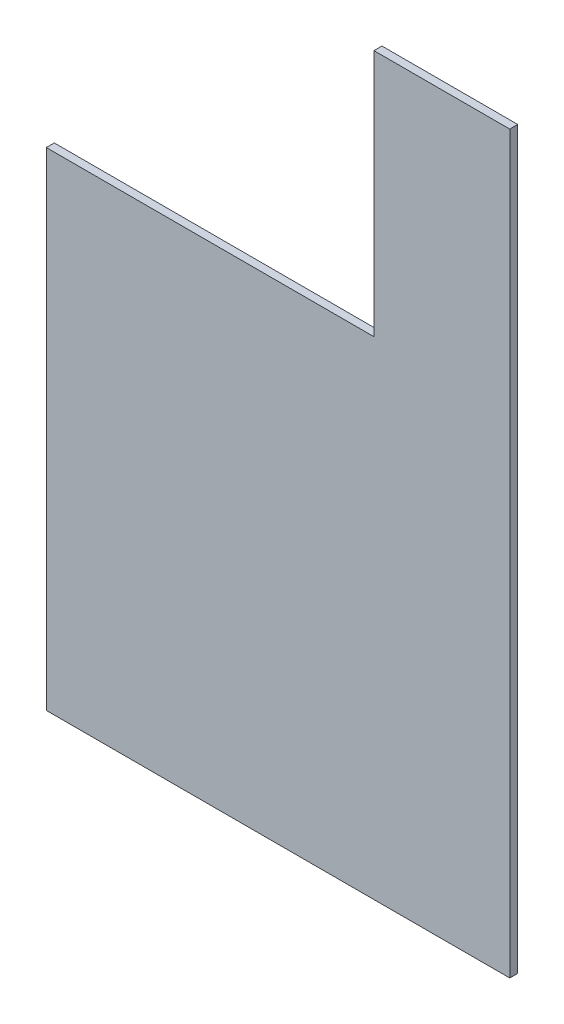
ISO-10303-21;
HEADER;
FILE_DESCRIPTION(('STEP AP214'),'2;1');
FILE_NAME('part.step','',(''),(''),'','','');
FILE_SCHEMA(('AUTOMOTIVE_DESIGN { 1 0 10303 214 1 1 1 1 }'));
ENDSEC;
DATA;
#1=APPLICATION_CONTEXT('core data for automotive mechanical design processes');
#2=APPLICATION_PROTOCOL_DEFINITION('international standard','automotive_design',2000,#1);
#3=PRODUCT_CONTEXT('',#1,'mechanical');
#4=PRODUCT('Part','Part','',(#3));
#5=PRODUCT_RELATED_PRODUCT_CATEGORY('part','',(#4));
#6=PRODUCT_DEFINITION_FORMATION('','',#4);
#7=PRODUCT_DEFINITION_CONTEXT('part definition',#1,'design');
#8=PRODUCT_DEFINITION('design','',#6,#7);
#9=PRODUCT_DEFINITION_SHAPE('','',#8);
#10=(LENGTH_UNIT() NAMED_UNIT(*) SI_UNIT(.MILLI.,.METRE.));
#11=(NAMED_UNIT(*) PLANE_ANGLE_UNIT() SI_UNIT($,.RADIAN.));
#12=(NAMED_UNIT(*) SI_UNIT($,.STERADIAN.) SOLID_ANGLE_UNIT());
#13=UNCERTAINTY_MEASURE_WITH_UNIT(LENGTH_MEASURE(1.E-05),#10,'distance_accuracy_value','');
#14=(GEOMETRIC_REPRESENTATION_CONTEXT(3) GLOBAL_UNCERTAINTY_ASSIGNED_CONTEXT((#13)) GLOBAL_UNIT_ASSIGNED_CONTEXT((#10,
#11,#12)) REPRESENTATION_CONTEXT('',''));
#15=CARTESIAN_POINT('',(0.,0.,0.));
#16=DIRECTION('',(0.,0.,1.));
#17=DIRECTION('',(1.,0.,0.));
#18=AXIS2_PLACEMENT_3D('',#15,#16,#17);
#19=CARTESIAN_POINT('',(0.,0.,2.));
#20=DIRECTION('',(1.,0.,0.));
#21=DIRECTION('',(0.,0.,-1.));
#22=AXIS2_PLACEMENT_3D('',#19,#20,#21);
#23=PLANE('',#22);
#24=DIRECTION('',(0.,-1.,0.));
#25=VECTOR('',#24,1.);
#26=CARTESIAN_POINT('',(0.,0.,0.));
#27=LINE('',#26,#25);
#28=CARTESIAN_POINT('',(0.,122.,0.));
#29=VERTEX_POINT('',#28);
#30=CARTESIAN_POINT('',(0.,0.,0.));
#31=VERTEX_POINT('',#30);
#32=EDGE_CURVE('E121',#29,#31,#27,.T.);
#33=ORIENTED_EDGE('',*,*,#32,.T.);
#34=DIRECTION('',(0.,0.,-1.));
#35=VECTOR('',#34,1.);
#36=CARTESIAN_POINT('',(0.,0.,2.));
#37=LINE('',#36,#35);
#38=CARTESIAN_POINT('',(0.,0.,2.));
#39=VERTEX_POINT('',#38);
#40=EDGE_CURVE('E11',#39,#31,#37,.T.);
#41=ORIENTED_EDGE('',*,*,#40,.F.);
#42=DIRECTION('',(0.,-1.,0.));
#43=VECTOR('',#42,1.);
#44=CARTESIAN_POINT('',(0.,0.,2.));
#45=LINE('',#44,#43);
#46=CARTESIAN_POINT('',(0.,122.,2.));
#47=VERTEX_POINT('',#46);
#48=EDGE_CURVE('E131',#47,#39,#45,.T.);
#49=ORIENTED_EDGE('',*,*,#48,.F.);
#50=DIRECTION('',(0.,0.,-1.));
#51=VECTOR('',#50,1.);
#52=CARTESIAN_POINT('',(0.,122.,2.));
#53=LINE('',#52,#51);
#54=EDGE_CURVE('E117',#47,#29,#53,.T.);
#55=ORIENTED_EDGE('',*,*,#54,.T.);
#56=EDGE_LOOP('',(#33,#41,#49,#55));
#57=FACE_BOUND('',#56,.T.);
#58=ADVANCED_FACE('F37',(#57),#23,.F.);
#59=CARTESIAN_POINT('',(0.,0.,2.));
#60=DIRECTION('',(0.,1.,0.));
#61=DIRECTION('',(0.,0.,1.));
#62=AXIS2_PLACEMENT_3D('',#59,#60,#61);
#63=PLANE('',#62);
#64=DIRECTION('',(1.,0.,0.));
#65=VECTOR('',#64,1.);
#66=CARTESIAN_POINT('',(0.,0.,0.));
#67=LINE('',#66,#65);
#68=CARTESIAN_POINT('',(116.,0.,0.));
#69=VERTEX_POINT('',#68);
#70=EDGE_CURVE('E124',#31,#69,#67,.T.);
#71=ORIENTED_EDGE('',*,*,#70,.T.);
#72=DIRECTION('',(0.,0.,-1.));
#73=VECTOR('',#72,1.);
#74=CARTESIAN_POINT('',(116.,0.,2.));
#75=LINE('',#74,#73);
#76=CARTESIAN_POINT('',(116.,0.,2.));
#77=VERTEX_POINT('',#76);
#78=EDGE_CURVE('E45',#77,#69,#75,.T.);
#79=ORIENTED_EDGE('',*,*,#78,.F.);
#80=DIRECTION('',(1.,0.,0.));
#81=VECTOR('',#80,1.);
#82=CARTESIAN_POINT('',(0.,0.,2.));
#83=LINE('',#82,#81);
#84=EDGE_CURVE('E90',#39,#77,#83,.T.);
#85=ORIENTED_EDGE('',*,*,#84,.F.);
#86=ORIENTED_EDGE('',*,*,#40,.T.);
#87=EDGE_LOOP('',(#71,#79,#85,#86));
#88=FACE_BOUND('',#87,.T.);
#89=ADVANCED_FACE('F155',(#88),#63,.F.);
#90=CARTESIAN_POINT('',(116.,0.,2.));
#91=DIRECTION('',(-1.,0.,0.));
#92=DIRECTION('',(0.,0.,1.));
#93=AXIS2_PLACEMENT_3D('',#90,#91,#92);
#94=PLANE('',#93);
#95=DIRECTION('',(0.,1.,0.));
#96=VECTOR('',#95,1.);
#97=CARTESIAN_POINT('',(116.,0.,0.));
#98=LINE('',#97,#96);
#99=CARTESIAN_POINT('',(116.,184.,0.));
#100=VERTEX_POINT('',#99);
#101=EDGE_CURVE('E126',#69,#100,#98,.T.);
#102=ORIENTED_EDGE('',*,*,#101,.T.);
#103=DIRECTION('',(0.,0.,-1.));
#104=VECTOR('',#103,1.);
#105=CARTESIAN_POINT('',(116.,184.,2.));
#106=LINE('',#105,#104);
#107=CARTESIAN_POINT('',(116.,184.,2.));
#108=VERTEX_POINT('',#107);
#109=EDGE_CURVE('E112',#108,#100,#106,.T.);
#110=ORIENTED_EDGE('',*,*,#109,.F.);
#111=DIRECTION('',(0.,1.,0.));
#112=VECTOR('',#111,1.);
#113=CARTESIAN_POINT('',(116.,0.,2.));
#114=LINE('',#113,#112);
#115=EDGE_CURVE('E103',#77,#108,#114,.T.);
#116=ORIENTED_EDGE('',*,*,#115,.F.);
#117=ORIENTED_EDGE('',*,*,#78,.T.);
#118=EDGE_LOOP('',(#102,#110,#116,#117));
#119=FACE_BOUND('',#118,.T.);
#120=ADVANCED_FACE('F137',(#119),#94,.F.);
#121=CARTESIAN_POINT('',(82.,184.,2.));
#122=DIRECTION('',(0.,-1.,0.));
#123=DIRECTION('',(0.,0.,-1.));
#124=AXIS2_PLACEMENT_3D('',#121,#122,#123);
#125=PLANE('',#124);
#126=DIRECTION('',(-1.,0.,0.));
#127=VECTOR('',#126,1.);
#128=CARTESIAN_POINT('',(82.,184.,0.));
#129=LINE('',#128,#127);
#130=CARTESIAN_POINT('',(82.,184.,0.));
#131=VERTEX_POINT('',#130);
#132=EDGE_CURVE('E111',#100,#131,#129,.T.);
#133=ORIENTED_EDGE('',*,*,#132,.T.);
#134=DIRECTION('',(0.,0.,-1.));
#135=VECTOR('',#134,1.);
#136=CARTESIAN_POINT('',(82.,184.,2.));
#137=LINE('',#136,#135);
#138=CARTESIAN_POINT('',(82.,184.,2.));
#139=VERTEX_POINT('',#138);
#140=EDGE_CURVE('E108',#139,#131,#137,.T.);
#141=ORIENTED_EDGE('',*,*,#140,.F.);
#142=DIRECTION('',(-1.,0.,0.));
#143=VECTOR('',#142,1.);
#144=CARTESIAN_POINT('',(82.,184.,2.));
#145=LINE('',#144,#143);
#146=EDGE_CURVE('E97',#108,#139,#145,.T.);
#147=ORIENTED_EDGE('',*,*,#146,.F.);
#148=ORIENTED_EDGE('',*,*,#109,.T.);
#149=EDGE_LOOP('',(#133,#141,#147,#148));
#150=FACE_BOUND('',#149,.T.);
#151=ADVANCED_FACE('F109',(#150),#125,.F.);
#152=CARTESIAN_POINT('',(82.,122.,2.));
#153=DIRECTION('',(1.,0.,0.));
#154=DIRECTION('',(0.,1.,0.));
#155=AXIS2_PLACEMENT_3D('',#152,#153,#154);
#156=PLANE('',#155);
#157=DIRECTION('',(0.,-1.,0.));
#158=VECTOR('',#157,1.);
#159=CARTESIAN_POINT('',(82.,122.,0.));
#160=LINE('',#159,#158);
#161=CARTESIAN_POINT('',(82.,122.,0.));
#162=VERTEX_POINT('',#161);
#163=EDGE_CURVE('E76',#131,#162,#160,.T.);
#164=ORIENTED_EDGE('',*,*,#163,.T.);
#165=DIRECTION('',(0.,0.,-1.));
#166=VECTOR('',#165,1.);
#167=CARTESIAN_POINT('',(82.,122.,2.));
#168=LINE('',#167,#166);
#169=CARTESIAN_POINT('',(82.,122.,2.));
#170=VERTEX_POINT('',#169);
#171=EDGE_CURVE('E113',#170,#162,#168,.T.);
#172=ORIENTED_EDGE('',*,*,#171,.F.);
#173=DIRECTION('',(0.,-1.,0.));
#174=VECTOR('',#173,1.);
#175=CARTESIAN_POINT('',(82.,122.,2.));
#176=LINE('',#175,#174);
#177=EDGE_CURVE('E101',#139,#170,#176,.T.);
#178=ORIENTED_EDGE('',*,*,#177,.F.);
#179=ORIENTED_EDGE('',*,*,#140,.T.);
#180=EDGE_LOOP('',(#164,#172,#178,#179));
#181=FACE_BOUND('',#180,.T.);
#182=ADVANCED_FACE('F115',(#181),#156,.F.);
#183=CARTESIAN_POINT('',(0.,122.,2.));
#184=DIRECTION('',(0.,-1.,0.));
#185=DIRECTION('',(0.,0.,-1.));
#186=AXIS2_PLACEMENT_3D('',#183,#184,#185);
#187=PLANE('',#186);
#188=DIRECTION('',(-1.,0.,0.));
#189=VECTOR('',#188,1.);
#190=CARTESIAN_POINT('',(0.,122.,0.));
#191=LINE('',#190,#189);
#192=EDGE_CURVE('E82',#162,#29,#191,.T.);
#193=ORIENTED_EDGE('',*,*,#192,.T.);
#194=ORIENTED_EDGE('',*,*,#54,.F.);
#195=DIRECTION('',(-1.,0.,0.));
#196=VECTOR('',#195,1.);
#197=CARTESIAN_POINT('',(0.,122.,2.));
#198=LINE('',#197,#196);
#199=EDGE_CURVE('E53',#170,#47,#198,.T.);
#200=ORIENTED_EDGE('',*,*,#199,.F.);
#201=ORIENTED_EDGE('',*,*,#171,.T.);
#202=EDGE_LOOP('',(#193,#194,#200,#201));
#203=FACE_BOUND('',#202,.T.);
#204=ADVANCED_FACE('F144',(#203),#187,.F.);
#205=CARTESIAN_POINT('',(0.,0.,2.));
#206=DIRECTION('',(0.,0.,-1.));
#207=DIRECTION('',(-1.,0.,0.));
#208=AXIS2_PLACEMENT_3D('',#205,#206,#207);
#209=PLANE('',#208);
#210=ORIENTED_EDGE('',*,*,#48,.T.);
#211=ORIENTED_EDGE('',*,*,#84,.T.);
#212=ORIENTED_EDGE('',*,*,#115,.T.);
#213=ORIENTED_EDGE('',*,*,#146,.T.);
#214=ORIENTED_EDGE('',*,*,#177,.T.);
#215=ORIENTED_EDGE('',*,*,#199,.T.);
#216=EDGE_LOOP('',(#210,#211,#212,#213,#214,#215));
#217=FACE_BOUND('',#216,.T.);
#218=ADVANCED_FACE('F99',(#217),#209,.F.);
#219=CARTESIAN_POINT('',(0.,0.,0.));
#220=DIRECTION('',(0.,0.,-1.));
#221=DIRECTION('',(-1.,0.,0.));
#222=AXIS2_PLACEMENT_3D('',#219,#220,#221);
#223=PLANE('',#222);
#224=ORIENTED_EDGE('',*,*,#32,.F.);
#225=ORIENTED_EDGE('',*,*,#192,.F.);
#226=ORIENTED_EDGE('',*,*,#163,.F.);
#227=ORIENTED_EDGE('',*,*,#132,.F.);
#228=ORIENTED_EDGE('',*,*,#101,.F.);
#229=ORIENTED_EDGE('',*,*,#70,.F.);
#230=EDGE_LOOP('',(#224,#225,#226,#227,#228,#229));
#231=FACE_BOUND('',#230,.T.);
#232=ADVANCED_FACE('F140',(#231),#223,.T.);
#233=CLOSED_SHELL('',(#58,#89,#120,#151,#182,#204,#218,#232));
#234=MANIFOLD_SOLID_BREP('B2',#233);
#235=ADVANCED_BREP_SHAPE_REPRESENTATION('',(#18,#234),#14);
#236=SHAPE_DEFINITION_REPRESENTATION(#9,#235);
ENDSEC;
END-ISO-10303-21;
